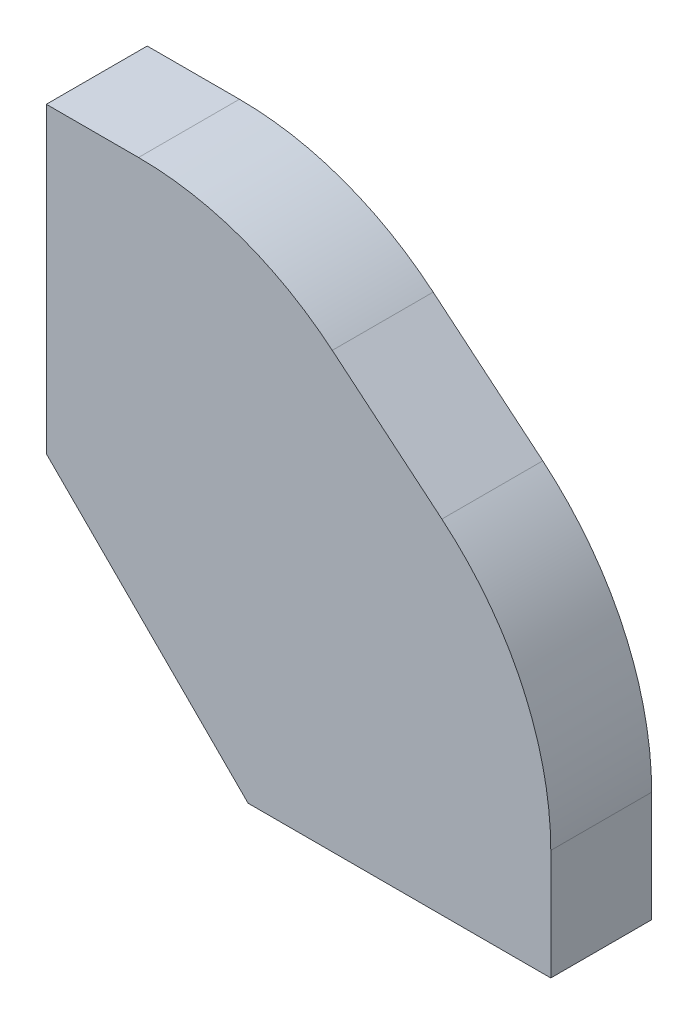
ISO-10303-21;
HEADER;
FILE_DESCRIPTION(('STEP AP214'),'2;1');
FILE_NAME('part.step','',(''),(''),'','','');
FILE_SCHEMA(('AUTOMOTIVE_DESIGN { 1 0 10303 214 1 1 1 1 }'));
ENDSEC;
DATA;
#1=APPLICATION_CONTEXT('core data for automotive mechanical design processes');
#2=APPLICATION_PROTOCOL_DEFINITION('international standard','automotive_design',2000,#1);
#3=PRODUCT_CONTEXT('',#1,'mechanical');
#4=PRODUCT('Part','Part','',(#3));
#5=PRODUCT_RELATED_PRODUCT_CATEGORY('part','',(#4));
#6=PRODUCT_DEFINITION_FORMATION('','',#4);
#7=PRODUCT_DEFINITION_CONTEXT('part definition',#1,'design');
#8=PRODUCT_DEFINITION('design','',#6,#7);
#9=PRODUCT_DEFINITION_SHAPE('','',#8);
#10=(LENGTH_UNIT() NAMED_UNIT(*) SI_UNIT(.MILLI.,.METRE.));
#11=(NAMED_UNIT(*) PLANE_ANGLE_UNIT() SI_UNIT($,.RADIAN.));
#12=(NAMED_UNIT(*) SI_UNIT($,.STERADIAN.) SOLID_ANGLE_UNIT());
#13=UNCERTAINTY_MEASURE_WITH_UNIT(LENGTH_MEASURE(1.E-05),#10,'distance_accuracy_value','');
#14=(GEOMETRIC_REPRESENTATION_CONTEXT(3) GLOBAL_UNCERTAINTY_ASSIGNED_CONTEXT((#13)) GLOBAL_UNIT_ASSIGNED_CONTEXT((#10,
#11,#12)) REPRESENTATION_CONTEXT('',''));
#15=CARTESIAN_POINT('',(0.,0.,0.));
#16=DIRECTION('',(0.,0.,1.));
#17=DIRECTION('',(1.,0.,0.));
#18=AXIS2_PLACEMENT_3D('',#15,#16,#17);
#19=CARTESIAN_POINT('',(20.0000000000001,0.,10.));
#20=DIRECTION('',(0.707106781186546,0.707106781186549,0.));
#21=DIRECTION('',(-0.707106781186549,0.707106781186546,0.));
#22=AXIS2_PLACEMENT_3D('',#19,#20,#21);
#23=PLANE('',#22);
#24=DIRECTION('',(0.707106781186549,-0.707106781186546,0.));
#25=VECTOR('',#24,1.);
#26=CARTESIAN_POINT('',(20.0000000000001,0.,0.));
#27=LINE('',#26,#25);
#28=CARTESIAN_POINT('',(0.,20.,0.));
#29=VERTEX_POINT('',#28);
#30=CARTESIAN_POINT('',(20.0000000000001,0.,0.));
#31=VERTEX_POINT('',#30);
#32=EDGE_CURVE('E129',#29,#31,#27,.T.);
#33=ORIENTED_EDGE('',*,*,#32,.T.);
#34=DIRECTION('',(0.,0.,-1.));
#35=VECTOR('',#34,1.);
#36=CARTESIAN_POINT('',(20.0000000000001,0.,10.));
#37=LINE('',#36,#35);
#38=CARTESIAN_POINT('',(20.0000000000001,0.,10.));
#39=VERTEX_POINT('',#38);
#40=EDGE_CURVE('E11',#39,#31,#37,.T.);
#41=ORIENTED_EDGE('',*,*,#40,.F.);
#42=DIRECTION('',(0.707106781186549,-0.707106781186546,0.));
#43=VECTOR('',#42,1.);
#44=CARTESIAN_POINT('',(20.0000000000001,0.,10.));
#45=LINE('',#44,#43);
#46=CARTESIAN_POINT('',(0.,20.,10.));
#47=VERTEX_POINT('',#46);
#48=EDGE_CURVE('E143',#47,#39,#45,.T.);
#49=ORIENTED_EDGE('',*,*,#48,.F.);
#50=DIRECTION('',(0.,0.,-1.));
#51=VECTOR('',#50,1.);
#52=CARTESIAN_POINT('',(0.,20.,10.));
#53=LINE('',#52,#51);
#54=EDGE_CURVE('E125',#47,#29,#53,.T.);
#55=ORIENTED_EDGE('',*,*,#54,.T.);
#56=EDGE_LOOP('',(#33,#41,#49,#55));
#57=FACE_BOUND('',#56,.T.);
#58=ADVANCED_FACE('F33',(#57),#23,.F.);
#59=CARTESIAN_POINT('',(50.,0.,10.));
#60=DIRECTION('',(0.,1.,0.));
#61=DIRECTION('',(-1.,0.,0.));
#62=AXIS2_PLACEMENT_3D('',#59,#60,#61);
#63=PLANE('',#62);
#64=DIRECTION('',(1.,0.,0.));
#65=VECTOR('',#64,1.);
#66=CARTESIAN_POINT('',(50.,0.,0.));
#67=LINE('',#66,#65);
#68=CARTESIAN_POINT('',(50.,0.,0.));
#69=VERTEX_POINT('',#68);
#70=EDGE_CURVE('E132',#31,#69,#67,.T.);
#71=ORIENTED_EDGE('',*,*,#70,.T.);
#72=DIRECTION('',(0.,0.,-1.));
#73=VECTOR('',#72,1.);
#74=CARTESIAN_POINT('',(50.,0.,10.));
#75=LINE('',#74,#73);
#76=CARTESIAN_POINT('',(50.,0.,10.));
#77=VERTEX_POINT('',#76);
#78=EDGE_CURVE('E41',#77,#69,#75,.T.);
#79=ORIENTED_EDGE('',*,*,#78,.F.);
#80=DIRECTION('',(1.,0.,0.));
#81=VECTOR('',#80,1.);
#82=CARTESIAN_POINT('',(50.,0.,10.));
#83=LINE('',#82,#81);
#84=EDGE_CURVE('E92',#39,#77,#83,.T.);
#85=ORIENTED_EDGE('',*,*,#84,.F.);
#86=ORIENTED_EDGE('',*,*,#40,.T.);
#87=EDGE_LOOP('',(#71,#79,#85,#86));
#88=FACE_BOUND('',#87,.T.);
#89=ADVANCED_FACE('F178',(#88),#63,.F.);
#90=CARTESIAN_POINT('',(50.,10.9487516204666,10.));
#91=DIRECTION('',(-1.,0.,0.));
#92=DIRECTION('',(0.,0.,1.));
#93=AXIS2_PLACEMENT_3D('',#90,#91,#92);
#94=PLANE('',#93);
#95=DIRECTION('',(0.,1.,0.));
#96=VECTOR('',#95,1.);
#97=CARTESIAN_POINT('',(50.,10.9487516204666,0.));
#98=LINE('',#97,#96);
#99=CARTESIAN_POINT('',(50.,10.9487516204666,0.));
#100=VERTEX_POINT('',#99);
#101=EDGE_CURVE('E134',#69,#100,#98,.T.);
#102=ORIENTED_EDGE('',*,*,#101,.T.);
#103=DIRECTION('',(0.,0.,-1.));
#104=VECTOR('',#103,1.);
#105=CARTESIAN_POINT('',(50.,10.9487516204666,10.));
#106=LINE('',#105,#104);
#107=CARTESIAN_POINT('',(50.,10.9487516204666,10.));
#108=VERTEX_POINT('',#107);
#109=EDGE_CURVE('E150',#108,#100,#106,.T.);
#110=ORIENTED_EDGE('',*,*,#109,.F.);
#111=DIRECTION('',(0.,1.,0.));
#112=VECTOR('',#111,1.);
#113=CARTESIAN_POINT('',(50.,10.9487516204666,10.));
#114=LINE('',#113,#112);
#115=EDGE_CURVE('E158',#77,#108,#114,.T.);
#116=ORIENTED_EDGE('',*,*,#115,.F.);
#117=ORIENTED_EDGE('',*,*,#78,.T.);
#118=EDGE_LOOP('',(#102,#110,#116,#117));
#119=FACE_BOUND('',#118,.T.);
#120=ADVANCED_FACE('F156',(#119),#94,.F.);
#121=CARTESIAN_POINT('',(20.,10.9487516204667,10.));
#122=DIRECTION('',(0.,0.,-1.));
#123=DIRECTION('',(-1.,0.,0.));
#124=AXIS2_PLACEMENT_3D('',#121,#122,#123);
#125=CYLINDRICAL_SURFACE('',#124,30.);
#126=CARTESIAN_POINT('',(20.,10.9487516204667,0.));
#127=DIRECTION('',(0.,0.,1.));
#128=DIRECTION('',(-1.,0.,0.));
#129=AXIS2_PLACEMENT_3D('',#126,#127,#128);
#130=CIRCLE('',#129,30.);
#131=CARTESIAN_POINT('',(39.2055319899343,33.9953900083881,0.));
#132=VERTEX_POINT('',#131);
#133=EDGE_CURVE('E136',#100,#132,#130,.T.);
#134=ORIENTED_EDGE('',*,*,#133,.T.);
#135=DIRECTION('',(0.,0.,-1.));
#136=VECTOR('',#135,1.);
#137=CARTESIAN_POINT('',(39.2055319899343,33.9953900083881,10.));
#138=LINE('',#137,#136);
#139=CARTESIAN_POINT('',(39.2055319899343,33.9953900083881,10.));
#140=VERTEX_POINT('',#139);
#141=EDGE_CURVE('E147',#140,#132,#138,.T.);
#142=ORIENTED_EDGE('',*,*,#141,.F.);
#143=CARTESIAN_POINT('',(20.,10.9487516204667,10.));
#144=DIRECTION('',(0.,0.,1.));
#145=DIRECTION('',(-1.,0.,0.));
#146=AXIS2_PLACEMENT_3D('',#143,#144,#145);
#147=CIRCLE('',#146,30.);
#148=EDGE_CURVE('E170',#108,#140,#147,.T.);
#149=ORIENTED_EDGE('',*,*,#148,.F.);
#150=ORIENTED_EDGE('',*,*,#109,.T.);
#151=EDGE_LOOP('',(#134,#142,#149,#150));
#152=FACE_BOUND('',#151,.T.);
#153=ADVANCED_FACE('F166',(#152),#125,.T.);
#154=CARTESIAN_POINT('',(28.3440339344946,43.0466383879212,10.));
#155=DIRECTION('',(-0.64018439966448,-0.768221279597376,0.));
#156=DIRECTION('',(0.768221279597376,-0.64018439966448,0.));
#157=AXIS2_PLACEMENT_3D('',#154,#155,#156);
#158=PLANE('',#157);
#159=DIRECTION('',(-0.768221279597376,0.64018439966448,0.));
#160=VECTOR('',#159,1.);
#161=CARTESIAN_POINT('',(28.3440339344946,43.0466383879212,0.));
#162=LINE('',#161,#160);
#163=CARTESIAN_POINT('',(28.3440339344946,43.0466383879212,0.));
#164=VERTEX_POINT('',#163);
#165=EDGE_CURVE('E138',#132,#164,#162,.T.);
#166=ORIENTED_EDGE('',*,*,#165,.T.);
#167=DIRECTION('',(0.,0.,-1.));
#168=VECTOR('',#167,1.);
#169=CARTESIAN_POINT('',(28.3440339344946,43.0466383879212,10.));
#170=LINE('',#169,#168);
#171=CARTESIAN_POINT('',(28.3440339344946,43.0466383879212,10.));
#172=VERTEX_POINT('',#171);
#173=EDGE_CURVE('E120',#172,#164,#170,.T.);
#174=ORIENTED_EDGE('',*,*,#173,.F.);
#175=DIRECTION('',(-0.768221279597376,0.64018439966448,0.));
#176=VECTOR('',#175,1.);
#177=CARTESIAN_POINT('',(28.3440339344946,43.0466383879212,10.));
#178=LINE('',#177,#176);
#179=EDGE_CURVE('E111',#140,#172,#178,.T.);
#180=ORIENTED_EDGE('',*,*,#179,.F.);
#181=ORIENTED_EDGE('',*,*,#141,.T.);
#182=EDGE_LOOP('',(#166,#174,#180,#181));
#183=FACE_BOUND('',#182,.T.);
#184=ADVANCED_FACE('F169',(#183),#158,.F.);
#185=CARTESIAN_POINT('',(9.13850194456007,20.,10.));
#186=DIRECTION('',(0.,0.,-1.));
#187=DIRECTION('',(-1.,0.,0.));
#188=AXIS2_PLACEMENT_3D('',#185,#186,#187);
#189=CYLINDRICAL_SURFACE('',#188,30.);
#190=CARTESIAN_POINT('',(9.13850194456007,20.,0.));
#191=DIRECTION('',(0.,0.,1.));
#192=DIRECTION('',(-1.,0.,0.));
#193=AXIS2_PLACEMENT_3D('',#190,#191,#192);
#194=CIRCLE('',#193,30.);
#195=CARTESIAN_POINT('',(9.13850194455995,50.,0.));
#196=VERTEX_POINT('',#195);
#197=EDGE_CURVE('E119',#164,#196,#194,.T.);
#198=ORIENTED_EDGE('',*,*,#197,.T.);
#199=DIRECTION('',(0.,0.,-1.));
#200=VECTOR('',#199,1.);
#201=CARTESIAN_POINT('',(9.13850194455995,50.,10.));
#202=LINE('',#201,#200);
#203=CARTESIAN_POINT('',(9.13850194455995,50.,10.));
#204=VERTEX_POINT('',#203);
#205=EDGE_CURVE('E116',#204,#196,#202,.T.);
#206=ORIENTED_EDGE('',*,*,#205,.F.);
#207=CARTESIAN_POINT('',(9.13850194456007,20.,10.));
#208=DIRECTION('',(0.,0.,1.));
#209=DIRECTION('',(-1.,0.,0.));
#210=AXIS2_PLACEMENT_3D('',#207,#208,#209);
#211=CIRCLE('',#210,30.);
#212=EDGE_CURVE('E105',#172,#204,#211,.T.);
#213=ORIENTED_EDGE('',*,*,#212,.F.);
#214=ORIENTED_EDGE('',*,*,#173,.T.);
#215=EDGE_LOOP('',(#198,#206,#213,#214));
#216=FACE_BOUND('',#215,.T.);
#217=ADVANCED_FACE('F117',(#216),#189,.T.);
#218=CARTESIAN_POINT('',(0.,50.,10.));
#219=DIRECTION('',(0.,-1.,0.));
#220=DIRECTION('',(0.,0.,-1.));
#221=AXIS2_PLACEMENT_3D('',#218,#219,#220);
#222=PLANE('',#221);
#223=DIRECTION('',(-1.,0.,0.));
#224=VECTOR('',#223,1.);
#225=CARTESIAN_POINT('',(0.,50.,0.));
#226=LINE('',#225,#224);
#227=CARTESIAN_POINT('',(0.,50.,0.));
#228=VERTEX_POINT('',#227);
#229=EDGE_CURVE('E78',#196,#228,#226,.T.);
#230=ORIENTED_EDGE('',*,*,#229,.T.);
#231=DIRECTION('',(0.,0.,-1.));
#232=VECTOR('',#231,1.);
#233=CARTESIAN_POINT('',(0.,50.,10.));
#234=LINE('',#233,#232);
#235=CARTESIAN_POINT('',(0.,50.,10.));
#236=VERTEX_POINT('',#235);
#237=EDGE_CURVE('E121',#236,#228,#234,.T.);
#238=ORIENTED_EDGE('',*,*,#237,.F.);
#239=DIRECTION('',(-1.,0.,0.));
#240=VECTOR('',#239,1.);
#241=CARTESIAN_POINT('',(0.,50.,10.));
#242=LINE('',#241,#240);
#243=EDGE_CURVE('E109',#204,#236,#242,.T.);
#244=ORIENTED_EDGE('',*,*,#243,.F.);
#245=ORIENTED_EDGE('',*,*,#205,.T.);
#246=EDGE_LOOP('',(#230,#238,#244,#245));
#247=FACE_BOUND('',#246,.T.);
#248=ADVANCED_FACE('F123',(#247),#222,.F.);
#249=CARTESIAN_POINT('',(0.,20.,10.));
#250=DIRECTION('',(1.,0.,0.));
#251=DIRECTION('',(0.,0.,-1.));
#252=AXIS2_PLACEMENT_3D('',#249,#250,#251);
#253=PLANE('',#252);
#254=DIRECTION('',(0.,-1.,0.));
#255=VECTOR('',#254,1.);
#256=CARTESIAN_POINT('',(0.,20.,0.));
#257=LINE('',#256,#255);
#258=EDGE_CURVE('E84',#228,#29,#257,.T.);
#259=ORIENTED_EDGE('',*,*,#258,.T.);
#260=ORIENTED_EDGE('',*,*,#54,.F.);
#261=DIRECTION('',(0.,-1.,0.));
#262=VECTOR('',#261,1.);
#263=CARTESIAN_POINT('',(0.,20.,10.));
#264=LINE('',#263,#262);
#265=EDGE_CURVE('E49',#236,#47,#264,.T.);
#266=ORIENTED_EDGE('',*,*,#265,.F.);
#267=ORIENTED_EDGE('',*,*,#237,.T.);
#268=EDGE_LOOP('',(#259,#260,#266,#267));
#269=FACE_BOUND('',#268,.T.);
#270=ADVANCED_FACE('F194',(#269),#253,.F.);
#271=CARTESIAN_POINT('',(9.13850194456007,20.,10.));
#272=DIRECTION('',(0.,0.,-1.));
#273=DIRECTION('',(-1.,0.,0.));
#274=AXIS2_PLACEMENT_3D('',#271,#272,#273);
#275=PLANE('',#274);
#276=ORIENTED_EDGE('',*,*,#48,.T.);
#277=ORIENTED_EDGE('',*,*,#84,.T.);
#278=ORIENTED_EDGE('',*,*,#115,.T.);
#279=ORIENTED_EDGE('',*,*,#148,.T.);
#280=ORIENTED_EDGE('',*,*,#179,.T.);
#281=ORIENTED_EDGE('',*,*,#212,.T.);
#282=ORIENTED_EDGE('',*,*,#243,.T.);
#283=ORIENTED_EDGE('',*,*,#265,.T.);
#284=EDGE_LOOP('',(#276,#277,#278,#279,#280,#281,#282,#283));
#285=FACE_BOUND('',#284,.T.);
#286=ADVANCED_FACE('F107',(#285),#275,.F.);
#287=CARTESIAN_POINT('',(9.13850194456007,20.,0.));
#288=DIRECTION('',(0.,0.,-1.));
#289=DIRECTION('',(-1.,0.,0.));
#290=AXIS2_PLACEMENT_3D('',#287,#288,#289);
#291=PLANE('',#290);
#292=ORIENTED_EDGE('',*,*,#32,.F.);
#293=ORIENTED_EDGE('',*,*,#258,.F.);
#294=ORIENTED_EDGE('',*,*,#229,.F.);
#295=ORIENTED_EDGE('',*,*,#197,.F.);
#296=ORIENTED_EDGE('',*,*,#165,.F.);
#297=ORIENTED_EDGE('',*,*,#133,.F.);
#298=ORIENTED_EDGE('',*,*,#101,.F.);
#299=ORIENTED_EDGE('',*,*,#70,.F.);
#300=EDGE_LOOP('',(#292,#293,#294,#295,#296,#297,#298,#299));
#301=FACE_BOUND('',#300,.T.);
#302=ADVANCED_FACE('F162',(#301),#291,.T.);
#303=CLOSED_SHELL('',(#58,#89,#120,#153,#184,#217,#248,#270,#286,#302));
#304=MANIFOLD_SOLID_BREP('B2',#303);
#305=ADVANCED_BREP_SHAPE_REPRESENTATION('',(#18,#304),#14);
#306=SHAPE_DEFINITION_REPRESENTATION(#9,#305);
ENDSEC;
END-ISO-10303-21;
